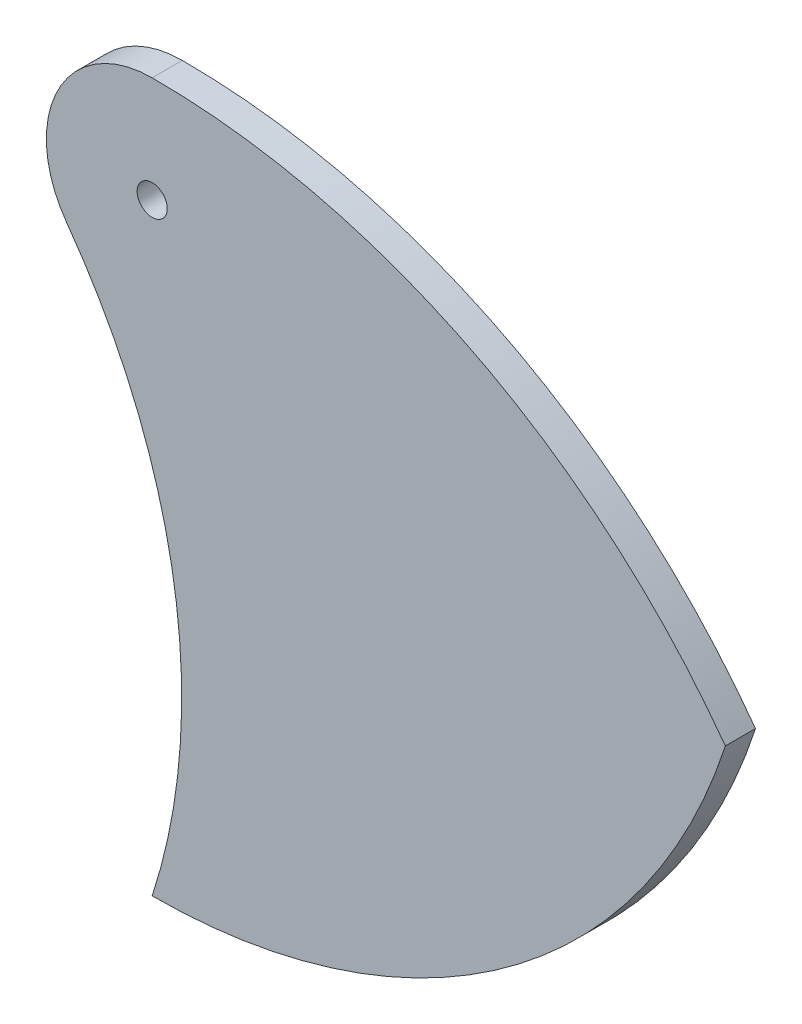
ISO-10303-21;
HEADER;
FILE_DESCRIPTION(('STEP AP214'),'2;1');
FILE_NAME('part.step','',(''),(''),'','','');
FILE_SCHEMA(('AUTOMOTIVE_DESIGN { 1 0 10303 214 1 1 1 1 }'));
ENDSEC;
DATA;
#1=APPLICATION_CONTEXT('core data for automotive mechanical design processes');
#2=APPLICATION_PROTOCOL_DEFINITION('international standard','automotive_design',2000,#1);
#3=PRODUCT_CONTEXT('',#1,'mechanical');
#4=PRODUCT('Part','Part','',(#3));
#5=PRODUCT_RELATED_PRODUCT_CATEGORY('part','',(#4));
#6=PRODUCT_DEFINITION_FORMATION('','',#4);
#7=PRODUCT_DEFINITION_CONTEXT('part definition',#1,'design');
#8=PRODUCT_DEFINITION('design','',#6,#7);
#9=PRODUCT_DEFINITION_SHAPE('','',#8);
#10=(LENGTH_UNIT() NAMED_UNIT(*) SI_UNIT(.MILLI.,.METRE.));
#11=(NAMED_UNIT(*) PLANE_ANGLE_UNIT() SI_UNIT($,.RADIAN.));
#12=(NAMED_UNIT(*) SI_UNIT($,.STERADIAN.) SOLID_ANGLE_UNIT());
#13=UNCERTAINTY_MEASURE_WITH_UNIT(LENGTH_MEASURE(1.E-05),#10,'distance_accuracy_value','');
#14=(GEOMETRIC_REPRESENTATION_CONTEXT(3) GLOBAL_UNCERTAINTY_ASSIGNED_CONTEXT((#13)) GLOBAL_UNIT_ASSIGNED_CONTEXT((#10,
#11,#12)) REPRESENTATION_CONTEXT('',''));
#15=CARTESIAN_POINT('',(0.,0.,0.));
#16=DIRECTION('',(0.,0.,1.));
#17=DIRECTION('',(1.,0.,0.));
#18=AXIS2_PLACEMENT_3D('',#15,#16,#17);
#19=CARTESIAN_POINT('',(-28.5316954888545,9.27050983124875,1.5));
#20=DIRECTION('',(0.,0.,-1.));
#21=DIRECTION('',(-1.,0.,0.));
#22=AXIS2_PLACEMENT_3D('',#19,#20,#21);
#23=CYLINDRICAL_SURFACE('',#22,30.);
#24=CARTESIAN_POINT('',(-28.5316954888545,9.27050983124875,0.));
#25=DIRECTION('',(0.,0.,1.));
#26=DIRECTION('',(1.,0.,0.));
#27=AXIS2_PLACEMENT_3D('',#24,#25,#26);
#28=CIRCLE('',#27,30.);
#29=CARTESIAN_POINT('',(0.,0.,0.));
#30=VERTEX_POINT('',#29);
#31=CARTESIAN_POINT('',(-4.26118565760598,26.9040674000228,0.));
#32=VERTEX_POINT('',#31);
#33=EDGE_CURVE('E102',#30,#32,#28,.T.);
#34=ORIENTED_EDGE('',*,*,#33,.F.);
#35=DIRECTION('',(0.,0.,-1.));
#36=VECTOR('',#35,1.);
#37=CARTESIAN_POINT('',(0.,0.,1.5));
#38=LINE('',#37,#36);
#39=CARTESIAN_POINT('',(0.,0.,1.5));
#40=VERTEX_POINT('',#39);
#41=EDGE_CURVE('E11',#40,#30,#38,.T.);
#42=ORIENTED_EDGE('',*,*,#41,.F.);
#43=CARTESIAN_POINT('',(-28.5316954888545,9.27050983124875,1.5));
#44=DIRECTION('',(0.,0.,1.));
#45=DIRECTION('',(1.,0.,0.));
#46=AXIS2_PLACEMENT_3D('',#43,#44,#45);
#47=CIRCLE('',#46,30.);
#48=CARTESIAN_POINT('',(-4.26118565760598,26.9040674000228,1.5));
#49=VERTEX_POINT('',#48);
#50=EDGE_CURVE('E84',#40,#49,#47,.T.);
#51=ORIENTED_EDGE('',*,*,#50,.T.);
#52=DIRECTION('',(0.,0.,-1.));
#53=VECTOR('',#52,1.);
#54=CARTESIAN_POINT('',(-4.26118565760598,26.9040674000228,1.5));
#55=LINE('',#54,#53);
#56=EDGE_CURVE('E74',#49,#32,#55,.T.);
#57=ORIENTED_EDGE('',*,*,#56,.T.);
#58=EDGE_LOOP('',(#34,#42,#51,#57));
#59=FACE_BOUND('',#58,.T.);
#60=ADVANCED_FACE('F35',(#59),#23,.F.);
#61=CARTESIAN_POINT('',(0.,30.,1.5));
#62=DIRECTION('',(0.,0.,-1.));
#63=DIRECTION('',(-1.,0.,0.));
#64=AXIS2_PLACEMENT_3D('',#61,#62,#63);
#65=CYLINDRICAL_SURFACE('',#64,30.);
#66=CARTESIAN_POINT('',(0.,30.,0.));
#67=DIRECTION('',(0.,0.,1.));
#68=DIRECTION('',(1.,0.,0.));
#69=AXIS2_PLACEMENT_3D('',#66,#67,#68);
#70=CIRCLE('',#69,30.);
#71=CARTESIAN_POINT('',(28.5316954888545,20.7294901687512,0.));
#72=VERTEX_POINT('',#71);
#73=EDGE_CURVE('E90',#30,#72,#70,.T.);
#74=ORIENTED_EDGE('',*,*,#73,.T.);
#75=DIRECTION('',(0.,0.,-1.));
#76=VECTOR('',#75,1.);
#77=CARTESIAN_POINT('',(28.5316954888545,20.7294901687512,1.5));
#78=LINE('',#77,#76);
#79=CARTESIAN_POINT('',(28.5316954888545,20.7294901687512,1.5));
#80=VERTEX_POINT('',#79);
#81=EDGE_CURVE('E44',#80,#72,#78,.T.);
#82=ORIENTED_EDGE('',*,*,#81,.F.);
#83=CARTESIAN_POINT('',(0.,30.,1.5));
#84=DIRECTION('',(0.,0.,1.));
#85=DIRECTION('',(1.,0.,0.));
#86=AXIS2_PLACEMENT_3D('',#83,#84,#85);
#87=CIRCLE('',#86,30.);
#88=EDGE_CURVE('E79',#40,#80,#87,.T.);
#89=ORIENTED_EDGE('',*,*,#88,.F.);
#90=ORIENTED_EDGE('',*,*,#41,.T.);
#91=EDGE_LOOP('',(#74,#82,#89,#90));
#92=FACE_BOUND('',#91,.T.);
#93=ADVANCED_FACE('F88',(#92),#65,.T.);
#94=CARTESIAN_POINT('',(0.,0.,1.5));
#95=DIRECTION('',(0.,0.,-1.));
#96=DIRECTION('',(-1.,0.,0.));
#97=AXIS2_PLACEMENT_3D('',#94,#95,#96);
#98=CYLINDRICAL_SURFACE('',#97,35.2671151375481);
#99=CARTESIAN_POINT('',(0.,0.,0.));
#100=DIRECTION('',(0.,0.,1.));
#101=DIRECTION('',(1.,0.,0.));
#102=AXIS2_PLACEMENT_3D('',#99,#100,#101);
#103=CIRCLE('',#102,35.2671151375481);
#104=CARTESIAN_POINT('',(0.,35.2671151375481,0.));
#105=VERTEX_POINT('',#104);
#106=EDGE_CURVE('E106',#105,#72,#103,.F.);
#107=ORIENTED_EDGE('',*,*,#106,.F.);
#108=DIRECTION('',(0.,0.,-1.));
#109=VECTOR('',#108,1.);
#110=CARTESIAN_POINT('',(0.,35.2671151375481,1.5));
#111=LINE('',#110,#109);
#112=CARTESIAN_POINT('',(0.,35.2671151375481,1.5));
#113=VERTEX_POINT('',#112);
#114=EDGE_CURVE('E67',#113,#105,#111,.T.);
#115=ORIENTED_EDGE('',*,*,#114,.F.);
#116=CARTESIAN_POINT('',(0.,0.,1.5));
#117=DIRECTION('',(0.,0.,1.));
#118=DIRECTION('',(1.,0.,0.));
#119=AXIS2_PLACEMENT_3D('',#116,#117,#118);
#120=CIRCLE('',#119,35.2671151375481);
#121=EDGE_CURVE('E83',#113,#80,#120,.F.);
#122=ORIENTED_EDGE('',*,*,#121,.T.);
#123=ORIENTED_EDGE('',*,*,#81,.T.);
#124=EDGE_LOOP('',(#107,#115,#122,#123));
#125=FACE_BOUND('',#124,.T.);
#126=ADVANCED_FACE('F94',(#125),#98,.T.);
#127=CARTESIAN_POINT('',(0.,30.,1.5));
#128=DIRECTION('',(0.,0.,-1.));
#129=DIRECTION('',(-1.,0.,0.));
#130=AXIS2_PLACEMENT_3D('',#127,#128,#129);
#131=CYLINDRICAL_SURFACE('',#130,0.75);
#132=CARTESIAN_POINT('',(0.,30.,1.5));
#133=DIRECTION('',(0.,0.,1.));
#134=DIRECTION('',(1.,0.,0.));
#135=AXIS2_PLACEMENT_3D('',#132,#133,#134);
#136=CIRCLE('',#135,0.75);
#137=CARTESIAN_POINT('',(0.75,30.,1.5));
#138=VERTEX_POINT('',#137);
#139=EDGE_CURVE('E110',#138,#138,#136,.T.);
#140=ORIENTED_EDGE('',*,*,#139,.T.);
#141=EDGE_LOOP('',(#140));
#142=FACE_BOUND('',#141,.T.);
#143=CARTESIAN_POINT('',(0.,30.,0.));
#144=DIRECTION('',(0.,0.,1.));
#145=DIRECTION('',(1.,0.,0.));
#146=AXIS2_PLACEMENT_3D('',#143,#144,#145);
#147=CIRCLE('',#146,0.75);
#148=CARTESIAN_POINT('',(0.75,30.,0.));
#149=VERTEX_POINT('',#148);
#150=EDGE_CURVE('E99',#149,#149,#147,.T.);
#151=ORIENTED_EDGE('',*,*,#150,.F.);
#152=EDGE_LOOP('',(#151));
#153=FACE_BOUND('',#152,.T.);
#154=ADVANCED_FACE('F37',(#142,#153),#131,.F.);
#155=CARTESIAN_POINT('',(0.,30.,1.5));
#156=DIRECTION('',(0.,0.,-1.));
#157=DIRECTION('',(-1.,0.,0.));
#158=AXIS2_PLACEMENT_3D('',#155,#156,#157);
#159=CYLINDRICAL_SURFACE('',#158,5.26711513754811);
#160=CARTESIAN_POINT('',(0.,30.,0.));
#161=DIRECTION('',(0.,0.,1.));
#162=DIRECTION('',(1.,0.,0.));
#163=AXIS2_PLACEMENT_3D('',#160,#161,#162);
#164=CIRCLE('',#163,5.26711513754811);
#165=EDGE_CURVE('E108',#105,#32,#164,.T.);
#166=ORIENTED_EDGE('',*,*,#165,.T.);
#167=ORIENTED_EDGE('',*,*,#56,.F.);
#168=CARTESIAN_POINT('',(0.,30.,1.5));
#169=DIRECTION('',(0.,0.,1.));
#170=DIRECTION('',(1.,0.,0.));
#171=AXIS2_PLACEMENT_3D('',#168,#169,#170);
#172=CIRCLE('',#171,5.26711513754811);
#173=EDGE_CURVE('E52',#113,#49,#172,.T.);
#174=ORIENTED_EDGE('',*,*,#173,.F.);
#175=ORIENTED_EDGE('',*,*,#114,.T.);
#176=EDGE_LOOP('',(#166,#167,#174,#175));
#177=FACE_BOUND('',#176,.T.);
#178=ADVANCED_FACE('F124',(#177),#159,.T.);
#179=CARTESIAN_POINT('',(0.,0.,1.5));
#180=DIRECTION('',(0.,0.,1.));
#181=DIRECTION('',(1.,0.,0.));
#182=AXIS2_PLACEMENT_3D('',#179,#180,#181);
#183=PLANE('',#182);
#184=ORIENTED_EDGE('',*,*,#139,.F.);
#185=EDGE_LOOP('',(#184));
#186=FACE_BOUND('',#185,.T.);
#187=ORIENTED_EDGE('',*,*,#50,.F.);
#188=ORIENTED_EDGE('',*,*,#88,.T.);
#189=ORIENTED_EDGE('',*,*,#121,.F.);
#190=ORIENTED_EDGE('',*,*,#173,.T.);
#191=EDGE_LOOP('',(#187,#188,#189,#190));
#192=FACE_BOUND('',#191,.T.);
#193=ADVANCED_FACE('F81',(#186,#192),#183,.T.);
#194=CARTESIAN_POINT('',(0.,0.,0.));
#195=DIRECTION('',(0.,0.,1.));
#196=DIRECTION('',(1.,0.,0.));
#197=AXIS2_PLACEMENT_3D('',#194,#195,#196);
#198=PLANE('',#197);
#199=ORIENTED_EDGE('',*,*,#150,.T.);
#200=EDGE_LOOP('',(#199));
#201=FACE_BOUND('',#200,.T.);
#202=ORIENTED_EDGE('',*,*,#33,.T.);
#203=ORIENTED_EDGE('',*,*,#165,.F.);
#204=ORIENTED_EDGE('',*,*,#106,.T.);
#205=ORIENTED_EDGE('',*,*,#73,.F.);
#206=EDGE_LOOP('',(#202,#203,#204,#205));
#207=FACE_BOUND('',#206,.T.);
#208=ADVANCED_FACE('F127',(#201,#207),#198,.F.);
#209=CLOSED_SHELL('',(#60,#93,#126,#154,#178,#193,#208));
#210=MANIFOLD_SOLID_BREP('B2',#209);
#211=ADVANCED_BREP_SHAPE_REPRESENTATION('',(#18,#210),#14);
#212=SHAPE_DEFINITION_REPRESENTATION(#9,#211);
ENDSEC;
END-ISO-10303-21;
